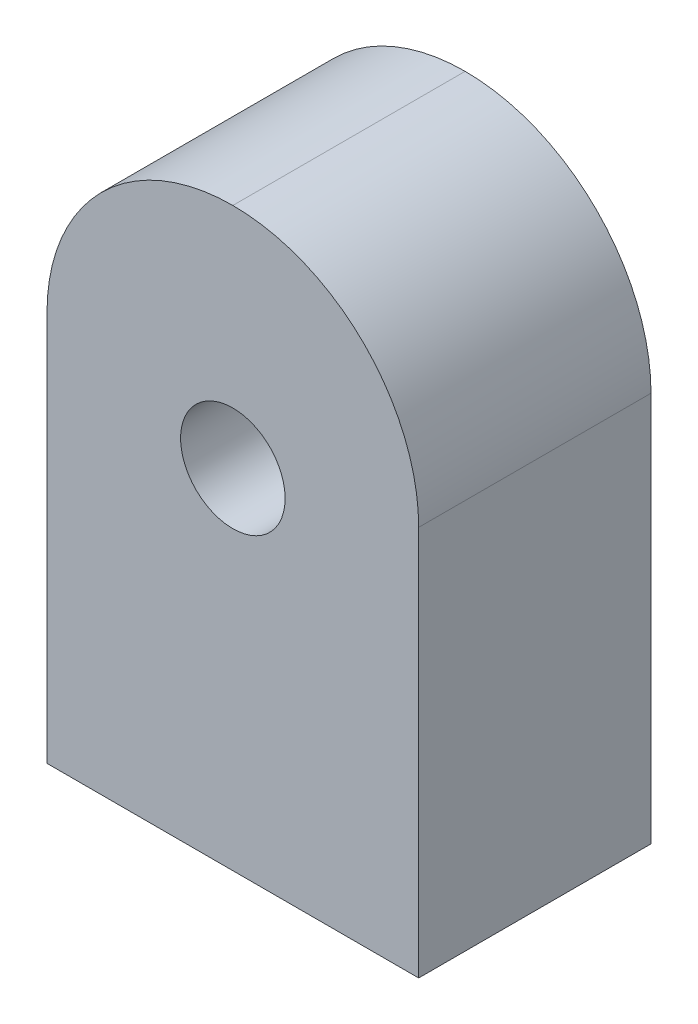
ISO-10303-21;
HEADER;
FILE_DESCRIPTION(('STEP AP214'),'2;1');
FILE_NAME('part.step','',(''),(''),'','','');
FILE_SCHEMA(('AUTOMOTIVE_DESIGN { 1 0 10303 214 1 1 1 1 }'));
ENDSEC;
DATA;
#1=APPLICATION_CONTEXT('core data for automotive mechanical design processes');
#2=APPLICATION_PROTOCOL_DEFINITION('international standard','automotive_design',2000,#1);
#3=PRODUCT_CONTEXT('',#1,'mechanical');
#4=PRODUCT('Part','Part','',(#3));
#5=PRODUCT_RELATED_PRODUCT_CATEGORY('part','',(#4));
#6=PRODUCT_DEFINITION_FORMATION('','',#4);
#7=PRODUCT_DEFINITION_CONTEXT('part definition',#1,'design');
#8=PRODUCT_DEFINITION('design','',#6,#7);
#9=PRODUCT_DEFINITION_SHAPE('','',#8);
#10=(LENGTH_UNIT() NAMED_UNIT(*) SI_UNIT(.MILLI.,.METRE.));
#11=(NAMED_UNIT(*) PLANE_ANGLE_UNIT() SI_UNIT($,.RADIAN.));
#12=(NAMED_UNIT(*) SI_UNIT($,.STERADIAN.) SOLID_ANGLE_UNIT());
#13=UNCERTAINTY_MEASURE_WITH_UNIT(LENGTH_MEASURE(1.E-05),#10,'distance_accuracy_value','');
#14=(GEOMETRIC_REPRESENTATION_CONTEXT(3) GLOBAL_UNCERTAINTY_ASSIGNED_CONTEXT((#13)) GLOBAL_UNIT_ASSIGNED_CONTEXT((#10,
#11,#12)) REPRESENTATION_CONTEXT('',''));
#15=CARTESIAN_POINT('',(0.,0.,0.));
#16=DIRECTION('',(0.,0.,1.));
#17=DIRECTION('',(1.,0.,0.));
#18=AXIS2_PLACEMENT_3D('',#15,#16,#17);
#19=CARTESIAN_POINT('',(0.,0.,10.));
#20=DIRECTION('',(1.,0.,0.));
#21=DIRECTION('',(0.,0.,-1.));
#22=AXIS2_PLACEMENT_3D('',#19,#20,#21);
#23=PLANE('',#22);
#24=DIRECTION('',(0.,-1.,0.));
#25=VECTOR('',#24,1.);
#26=CARTESIAN_POINT('',(0.,0.,10.));
#27=LINE('',#26,#25);
#28=CARTESIAN_POINT('',(0.,12.,10.));
#29=VERTEX_POINT('',#28);
#30=CARTESIAN_POINT('',(0.,-4.8,10.));
#31=VERTEX_POINT('',#30);
#32=EDGE_CURVE('E117',#29,#31,#27,.T.);
#33=ORIENTED_EDGE('',*,*,#32,.F.);
#34=DIRECTION('',(0.,0.,-1.));
#35=VECTOR('',#34,1.);
#36=CARTESIAN_POINT('',(0.,12.,10.));
#37=LINE('',#36,#35);
#38=CARTESIAN_POINT('',(0.,12.,0.));
#39=VERTEX_POINT('',#38);
#40=EDGE_CURVE('E11',#29,#39,#37,.T.);
#41=ORIENTED_EDGE('',*,*,#40,.T.);
#42=DIRECTION('',(0.,-1.,0.));
#43=VECTOR('',#42,1.);
#44=CARTESIAN_POINT('',(0.,0.,0.));
#45=LINE('',#44,#43);
#46=CARTESIAN_POINT('',(0.,-4.8,0.));
#47=VERTEX_POINT('',#46);
#48=EDGE_CURVE('E85',#39,#47,#45,.T.);
#49=ORIENTED_EDGE('',*,*,#48,.T.);
#50=DIRECTION('',(0.,0.,1.));
#51=VECTOR('',#50,1.);
#52=CARTESIAN_POINT('',(0.,-4.8,0.));
#53=LINE('',#52,#51);
#54=EDGE_CURVE('E87',#47,#31,#53,.T.);
#55=ORIENTED_EDGE('',*,*,#54,.T.);
#56=EDGE_LOOP('',(#33,#41,#49,#55));
#57=FACE_BOUND('',#56,.T.);
#58=ADVANCED_FACE('F41',(#57),#23,.F.);
#59=CARTESIAN_POINT('',(16.,0.,10.));
#60=DIRECTION('',(-1.,0.,0.));
#61=DIRECTION('',(0.,0.,1.));
#62=AXIS2_PLACEMENT_3D('',#59,#60,#61);
#63=PLANE('',#62);
#64=DIRECTION('',(0.,1.,0.));
#65=VECTOR('',#64,1.);
#66=CARTESIAN_POINT('',(16.,0.,0.));
#67=LINE('',#66,#65);
#68=CARTESIAN_POINT('',(16.,-4.8,0.));
#69=VERTEX_POINT('',#68);
#70=CARTESIAN_POINT('',(16.,12.,0.));
#71=VERTEX_POINT('',#70);
#72=EDGE_CURVE('E93',#69,#71,#67,.T.);
#73=ORIENTED_EDGE('',*,*,#72,.T.);
#74=DIRECTION('',(0.,0.,-1.));
#75=VECTOR('',#74,1.);
#76=CARTESIAN_POINT('',(16.,12.,10.));
#77=LINE('',#76,#75);
#78=CARTESIAN_POINT('',(16.,12.,10.));
#79=VERTEX_POINT('',#78);
#80=EDGE_CURVE('E126',#71,#79,#77,.F.);
#81=ORIENTED_EDGE('',*,*,#80,.T.);
#82=DIRECTION('',(0.,1.,0.));
#83=VECTOR('',#82,1.);
#84=CARTESIAN_POINT('',(16.,0.,10.));
#85=LINE('',#84,#83);
#86=CARTESIAN_POINT('',(16.,-4.8,10.));
#87=VERTEX_POINT('',#86);
#88=EDGE_CURVE('E119',#87,#79,#85,.T.);
#89=ORIENTED_EDGE('',*,*,#88,.F.);
#90=DIRECTION('',(0.,0.,1.));
#91=VECTOR('',#90,1.);
#92=CARTESIAN_POINT('',(16.,-4.8,0.));
#93=LINE('',#92,#91);
#94=EDGE_CURVE('E103',#69,#87,#93,.T.);
#95=ORIENTED_EDGE('',*,*,#94,.F.);
#96=EDGE_LOOP('',(#73,#81,#89,#95));
#97=FACE_BOUND('',#96,.T.);
#98=ADVANCED_FACE('F132',(#97),#63,.F.);
#99=CARTESIAN_POINT('',(0.,0.,10.));
#100=DIRECTION('',(0.,0.,-1.));
#101=DIRECTION('',(-1.,0.,0.));
#102=AXIS2_PLACEMENT_3D('',#99,#100,#101);
#103=PLANE('',#102);
#104=CARTESIAN_POINT('',(8.,10.2,10.));
#105=DIRECTION('',(0.,0.,1.));
#106=DIRECTION('',(1.,0.,0.));
#107=AXIS2_PLACEMENT_3D('',#104,#105,#106);
#108=CIRCLE('',#107,2.25);
#109=CARTESIAN_POINT('',(10.25,10.2,10.));
#110=VERTEX_POINT('',#109);
#111=EDGE_CURVE('E114',#110,#110,#108,.T.);
#112=ORIENTED_EDGE('',*,*,#111,.F.);
#113=EDGE_LOOP('',(#112));
#114=FACE_BOUND('',#113,.T.);
#115=ORIENTED_EDGE('',*,*,#88,.T.);
#116=CARTESIAN_POINT('',(8.,12.,10.));
#117=DIRECTION('',(0.,0.,-1.));
#118=DIRECTION('',(-1.,0.,0.));
#119=AXIS2_PLACEMENT_3D('',#116,#117,#118);
#120=CIRCLE('',#119,8.);
#121=CARTESIAN_POINT('',(8.,20.,10.));
#122=VERTEX_POINT('',#121);
#123=EDGE_CURVE('E50',#79,#122,#120,.F.);
#124=ORIENTED_EDGE('',*,*,#123,.T.);
#125=CARTESIAN_POINT('',(8.,12.,10.));
#126=DIRECTION('',(0.,0.,-1.));
#127=DIRECTION('',(-1.,0.,0.));
#128=AXIS2_PLACEMENT_3D('',#125,#126,#127);
#129=CIRCLE('',#128,8.);
#130=EDGE_CURVE('E60',#122,#29,#129,.F.);
#131=ORIENTED_EDGE('',*,*,#130,.T.);
#132=ORIENTED_EDGE('',*,*,#32,.T.);
#133=DIRECTION('',(1.,0.,0.));
#134=VECTOR('',#133,1.);
#135=CARTESIAN_POINT('',(0.,-4.8,10.));
#136=LINE('',#135,#134);
#137=EDGE_CURVE('E102',#31,#87,#136,.T.);
#138=ORIENTED_EDGE('',*,*,#137,.T.);
#139=EDGE_LOOP('',(#115,#124,#131,#132,#138));
#140=FACE_BOUND('',#139,.T.);
#141=ADVANCED_FACE('F135',(#114,#140),#103,.F.);
#142=CARTESIAN_POINT('',(0.,0.,0.));
#143=DIRECTION('',(0.,0.,-1.));
#144=DIRECTION('',(-1.,0.,0.));
#145=AXIS2_PLACEMENT_3D('',#142,#143,#144);
#146=PLANE('',#145);
#147=CARTESIAN_POINT('',(8.,10.2,0.));
#148=DIRECTION('',(0.,0.,1.));
#149=DIRECTION('',(1.,0.,0.));
#150=AXIS2_PLACEMENT_3D('',#147,#148,#149);
#151=CIRCLE('',#150,2.25);
#152=CARTESIAN_POINT('',(10.25,10.2,0.));
#153=VERTEX_POINT('',#152);
#154=EDGE_CURVE('E94',#153,#153,#151,.T.);
#155=ORIENTED_EDGE('',*,*,#154,.T.);
#156=EDGE_LOOP('',(#155));
#157=FACE_BOUND('',#156,.T.);
#158=CARTESIAN_POINT('',(8.,12.,0.));
#159=DIRECTION('',(0.,0.,-1.));
#160=DIRECTION('',(-1.,0.,0.));
#161=AXIS2_PLACEMENT_3D('',#158,#159,#160);
#162=CIRCLE('',#161,8.);
#163=CARTESIAN_POINT('',(8.,20.,0.));
#164=VERTEX_POINT('',#163);
#165=EDGE_CURVE('E120',#39,#164,#162,.T.);
#166=ORIENTED_EDGE('',*,*,#165,.T.);
#167=CARTESIAN_POINT('',(8.,12.,0.));
#168=DIRECTION('',(0.,0.,-1.));
#169=DIRECTION('',(-1.,0.,0.));
#170=AXIS2_PLACEMENT_3D('',#167,#168,#169);
#171=CIRCLE('',#170,8.);
#172=EDGE_CURVE('E124',#164,#71,#171,.T.);
#173=ORIENTED_EDGE('',*,*,#172,.T.);
#174=ORIENTED_EDGE('',*,*,#72,.F.);
#175=DIRECTION('',(1.,0.,0.));
#176=VECTOR('',#175,1.);
#177=CARTESIAN_POINT('',(0.,-4.8,0.));
#178=LINE('',#177,#176);
#179=EDGE_CURVE('E100',#47,#69,#178,.T.);
#180=ORIENTED_EDGE('',*,*,#179,.F.);
#181=ORIENTED_EDGE('',*,*,#48,.F.);
#182=EDGE_LOOP('',(#166,#173,#174,#180,#181));
#183=FACE_BOUND('',#182,.T.);
#184=ADVANCED_FACE('F105',(#157,#183),#146,.T.);
#185=CARTESIAN_POINT('',(8.,10.2,0.));
#186=DIRECTION('',(0.,0.,1.));
#187=DIRECTION('',(1.,0.,0.));
#188=AXIS2_PLACEMENT_3D('',#185,#186,#187);
#189=CYLINDRICAL_SURFACE('',#188,2.25);
#190=ORIENTED_EDGE('',*,*,#154,.F.);
#191=EDGE_LOOP('',(#190));
#192=FACE_BOUND('',#191,.T.);
#193=ORIENTED_EDGE('',*,*,#111,.T.);
#194=EDGE_LOOP('',(#193));
#195=FACE_BOUND('',#194,.T.);
#196=ADVANCED_FACE('F147',(#192,#195),#189,.F.);
#197=CARTESIAN_POINT('',(8.,12.,10.));
#198=DIRECTION('',(0.,0.,-1.));
#199=DIRECTION('',(-1.,0.,0.));
#200=AXIS2_PLACEMENT_3D('',#197,#198,#199);
#201=CYLINDRICAL_SURFACE('',#200,8.);
#202=ORIENTED_EDGE('',*,*,#40,.F.);
#203=ORIENTED_EDGE('',*,*,#130,.F.);
#204=DIRECTION('',(0.,0.,-1.));
#205=VECTOR('',#204,1.);
#206=CARTESIAN_POINT('',(8.,20.,10.));
#207=LINE('',#206,#205);
#208=EDGE_CURVE('E45',#164,#122,#207,.F.);
#209=ORIENTED_EDGE('',*,*,#208,.F.);
#210=ORIENTED_EDGE('',*,*,#165,.F.);
#211=EDGE_LOOP('',(#202,#203,#209,#210));
#212=FACE_BOUND('',#211,.T.);
#213=ADVANCED_FACE('F43',(#212),#201,.T.);
#214=CARTESIAN_POINT('',(8.,12.,10.));
#215=DIRECTION('',(0.,0.,-1.));
#216=DIRECTION('',(-1.,0.,0.));
#217=AXIS2_PLACEMENT_3D('',#214,#215,#216);
#218=CYLINDRICAL_SURFACE('',#217,8.);
#219=ORIENTED_EDGE('',*,*,#123,.F.);
#220=ORIENTED_EDGE('',*,*,#80,.F.);
#221=ORIENTED_EDGE('',*,*,#172,.F.);
#222=ORIENTED_EDGE('',*,*,#208,.T.);
#223=EDGE_LOOP('',(#219,#220,#221,#222));
#224=FACE_BOUND('',#223,.T.);
#225=ADVANCED_FACE('F139',(#224),#218,.T.);
#226=CARTESIAN_POINT('',(0.,-4.8,0.));
#227=DIRECTION('',(0.,-1.,0.));
#228=DIRECTION('',(0.,0.,-1.));
#229=AXIS2_PLACEMENT_3D('',#226,#227,#228);
#230=PLANE('',#229);
#231=ORIENTED_EDGE('',*,*,#137,.F.);
#232=ORIENTED_EDGE('',*,*,#54,.F.);
#233=ORIENTED_EDGE('',*,*,#179,.T.);
#234=ORIENTED_EDGE('',*,*,#94,.T.);
#235=EDGE_LOOP('',(#231,#232,#233,#234));
#236=FACE_BOUND('',#235,.T.);
#237=ADVANCED_FACE('F98',(#236),#230,.T.);
#238=CLOSED_SHELL('',(#58,#98,#141,#184,#196,#213,#225,#237));
#239=MANIFOLD_SOLID_BREP('B2',#238);
#240=ADVANCED_BREP_SHAPE_REPRESENTATION('',(#18,#239),#14);
#241=SHAPE_DEFINITION_REPRESENTATION(#9,#240);
ENDSEC;
END-ISO-10303-21;
